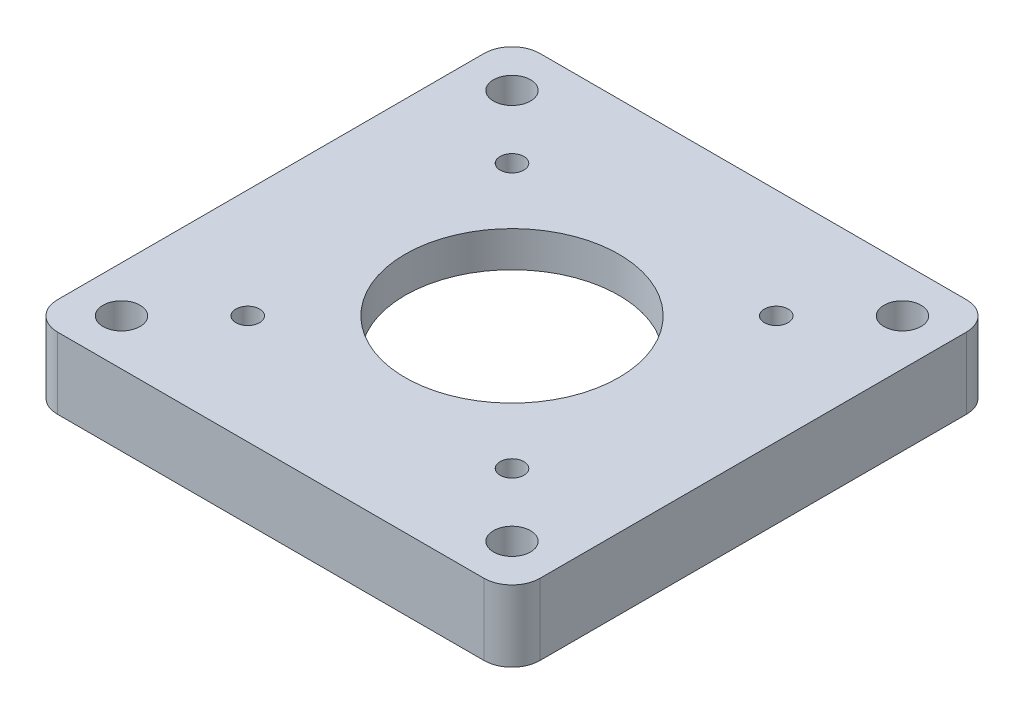
ISO-10303-21;
HEADER;
FILE_DESCRIPTION(('STEP AP214'),'2;1');
FILE_NAME('part.step','',(''),(''),'','','');
FILE_SCHEMA(('AUTOMOTIVE_DESIGN { 1 0 10303 214 1 1 1 1 }'));
ENDSEC;
DATA;
#1=APPLICATION_CONTEXT('core data for automotive mechanical design processes');
#2=APPLICATION_PROTOCOL_DEFINITION('international standard','automotive_design',2000,#1);
#3=PRODUCT_CONTEXT('',#1,'mechanical');
#4=PRODUCT('Part','Part','',(#3));
#5=PRODUCT_RELATED_PRODUCT_CATEGORY('part','',(#4));
#6=PRODUCT_DEFINITION_FORMATION('','',#4);
#7=PRODUCT_DEFINITION_CONTEXT('part definition',#1,'design');
#8=PRODUCT_DEFINITION('design','',#6,#7);
#9=PRODUCT_DEFINITION_SHAPE('','',#8);
#10=(LENGTH_UNIT() NAMED_UNIT(*) SI_UNIT(.MILLI.,.METRE.));
#11=(NAMED_UNIT(*) PLANE_ANGLE_UNIT() SI_UNIT($,.RADIAN.));
#12=(NAMED_UNIT(*) SI_UNIT($,.STERADIAN.) SOLID_ANGLE_UNIT());
#13=UNCERTAINTY_MEASURE_WITH_UNIT(LENGTH_MEASURE(1.E-05),#10,'distance_accuracy_value','');
#14=(GEOMETRIC_REPRESENTATION_CONTEXT(3) GLOBAL_UNCERTAINTY_ASSIGNED_CONTEXT((#13)) GLOBAL_UNIT_ASSIGNED_CONTEXT((#10,
#11,#12)) REPRESENTATION_CONTEXT('',''));
#15=CARTESIAN_POINT('',(0.,0.,0.));
#16=DIRECTION('',(0.,0.,1.));
#17=DIRECTION('',(1.,0.,0.));
#18=AXIS2_PLACEMENT_3D('',#15,#16,#17);
#19=CARTESIAN_POINT('',(0.,0.,0.));
#20=DIRECTION('',(0.,1.,0.));
#21=DIRECTION('',(1.,0.,0.));
#22=AXIS2_PLACEMENT_3D('',#19,#20,#21);
#23=PLANE('',#22);
#24=CARTESIAN_POINT('',(0.,0.,0.));
#25=DIRECTION('',(0.,-1.,0.));
#26=DIRECTION('',(1.,0.,0.));
#27=AXIS2_PLACEMENT_3D('',#24,#25,#26);
#28=CIRCLE('',#27,19.05);
#29=CARTESIAN_POINT('',(-19.05,0.,0.));
#30=VERTEX_POINT('',#29);
#31=EDGE_CURVE('E11',#30,#30,#28,.T.);
#32=ORIENTED_EDGE('',*,*,#31,.F.);
#33=EDGE_LOOP('',(#32));
#34=FACE_BOUND('',#33,.T.);
#35=CARTESIAN_POINT('',(-23.55,0.,23.55));
#36=DIRECTION('',(0.,1.,0.));
#37=DIRECTION('',(0.,0.,-1.));
#38=AXIS2_PLACEMENT_3D('',#35,#36,#37);
#39=CIRCLE('',#38,2.117);
#40=CARTESIAN_POINT('',(-23.55,0.,25.667));
#41=VERTEX_POINT('',#40);
#42=EDGE_CURVE('E290',#41,#41,#39,.T.);
#43=ORIENTED_EDGE('',*,*,#42,.T.);
#44=EDGE_LOOP('',(#43));
#45=FACE_BOUND('',#44,.T.);
#46=CARTESIAN_POINT('',(23.55,0.,-23.55));
#47=DIRECTION('',(0.,1.,0.));
#48=DIRECTION('',(0.,0.,-1.));
#49=AXIS2_PLACEMENT_3D('',#46,#47,#48);
#50=CIRCLE('',#49,2.117);
#51=CARTESIAN_POINT('',(23.55,0.,-21.433));
#52=VERTEX_POINT('',#51);
#53=EDGE_CURVE('E445',#52,#52,#50,.T.);
#54=ORIENTED_EDGE('',*,*,#53,.T.);
#55=EDGE_LOOP('',(#54));
#56=FACE_BOUND('',#55,.T.);
#57=CARTESIAN_POINT('',(23.55,0.,23.55));
#58=DIRECTION('',(0.,1.,0.));
#59=DIRECTION('',(0.,0.,-1.));
#60=AXIS2_PLACEMENT_3D('',#57,#58,#59);
#61=CIRCLE('',#60,2.117);
#62=CARTESIAN_POINT('',(23.55,0.,25.667));
#63=VERTEX_POINT('',#62);
#64=EDGE_CURVE('E318',#63,#63,#61,.T.);
#65=ORIENTED_EDGE('',*,*,#64,.T.);
#66=EDGE_LOOP('',(#65));
#67=FACE_BOUND('',#66,.T.);
#68=CARTESIAN_POINT('',(-23.55,0.,-23.55));
#69=DIRECTION('',(0.,1.,0.));
#70=DIRECTION('',(0.,0.,-1.));
#71=AXIS2_PLACEMENT_3D('',#68,#69,#70);
#72=CIRCLE('',#71,2.117);
#73=CARTESIAN_POINT('',(-23.55,0.,-21.433));
#74=VERTEX_POINT('',#73);
#75=EDGE_CURVE('E426',#74,#74,#72,.T.);
#76=ORIENTED_EDGE('',*,*,#75,.T.);
#77=EDGE_LOOP('',(#76));
#78=FACE_BOUND('',#77,.T.);
#79=CARTESIAN_POINT('',(0.,0.,0.));
#80=DIRECTION('',(0.,-1.,0.));
#81=DIRECTION('',(1.,0.,0.));
#82=AXIS2_PLACEMENT_3D('',#79,#80,#81);
#83=CIRCLE('',#82,36.5);
#84=CARTESIAN_POINT('',(-20.3216669399022,0.,-30.3196281768706));
#85=VERTEX_POINT('',#84);
#86=CARTESIAN_POINT('',(20.3216669399023,0.,-30.3196281768706));
#87=VERTEX_POINT('',#86);
#88=EDGE_CURVE('E407',#85,#87,#83,.T.);
#89=ORIENTED_EDGE('',*,*,#88,.T.);
#90=CARTESIAN_POINT('',(23.55,0.,-23.55));
#91=DIRECTION('',(0.,-1.,0.));
#92=DIRECTION('',(1.,0.,0.));
#93=AXIS2_PLACEMENT_3D('',#90,#91,#92);
#94=CIRCLE('',#93,7.5);
#95=CARTESIAN_POINT('',(30.3196281768706,0.,-20.3216669399023));
#96=VERTEX_POINT('',#95);
#97=EDGE_CURVE('E389',#87,#96,#94,.T.);
#98=ORIENTED_EDGE('',*,*,#97,.T.);
#99=CARTESIAN_POINT('',(0.,0.,0.));
#100=DIRECTION('',(0.,-1.,0.));
#101=DIRECTION('',(1.,0.,0.));
#102=AXIS2_PLACEMENT_3D('',#99,#100,#101);
#103=CIRCLE('',#102,36.5);
#104=CARTESIAN_POINT('',(30.3196281768706,0.,20.3216669399023));
#105=VERTEX_POINT('',#104);
#106=EDGE_CURVE('E397',#96,#105,#103,.T.);
#107=ORIENTED_EDGE('',*,*,#106,.T.);
#108=CARTESIAN_POINT('',(23.55,0.,23.55));
#109=DIRECTION('',(0.,-1.,0.));
#110=DIRECTION('',(1.,0.,0.));
#111=AXIS2_PLACEMENT_3D('',#108,#109,#110);
#112=CIRCLE('',#111,7.5);
#113=CARTESIAN_POINT('',(20.3216669399023,0.,30.3196281768706));
#114=VERTEX_POINT('',#113);
#115=EDGE_CURVE('E357',#105,#114,#112,.T.);
#116=ORIENTED_EDGE('',*,*,#115,.T.);
#117=CARTESIAN_POINT('',(0.,0.,0.));
#118=DIRECTION('',(0.,-1.,0.));
#119=DIRECTION('',(1.,0.,0.));
#120=AXIS2_PLACEMENT_3D('',#117,#118,#119);
#121=CIRCLE('',#120,36.5);
#122=CARTESIAN_POINT('',(-20.3216669399023,0.,30.3196281768706));
#123=VERTEX_POINT('',#122);
#124=EDGE_CURVE('E401',#114,#123,#121,.T.);
#125=ORIENTED_EDGE('',*,*,#124,.T.);
#126=CARTESIAN_POINT('',(-23.55,0.,23.55));
#127=DIRECTION('',(0.,-1.,0.));
#128=DIRECTION('',(1.,0.,0.));
#129=AXIS2_PLACEMENT_3D('',#126,#127,#128);
#130=CIRCLE('',#129,7.5);
#131=CARTESIAN_POINT('',(-30.3196281768706,0.,20.3216669399023));
#132=VERTEX_POINT('',#131);
#133=EDGE_CURVE('E373',#123,#132,#130,.T.);
#134=ORIENTED_EDGE('',*,*,#133,.T.);
#135=CARTESIAN_POINT('',(0.,0.,0.));
#136=DIRECTION('',(0.,-1.,0.));
#137=DIRECTION('',(1.,0.,0.));
#138=AXIS2_PLACEMENT_3D('',#135,#136,#137);
#139=CIRCLE('',#138,36.5);
#140=CARTESIAN_POINT('',(-30.3196281768706,0.,-20.3216669399023));
#141=VERTEX_POINT('',#140);
#142=EDGE_CURVE('E404',#132,#141,#139,.T.);
#143=ORIENTED_EDGE('',*,*,#142,.T.);
#144=CARTESIAN_POINT('',(-23.55,0.,-23.55));
#145=DIRECTION('',(0.,-1.,0.));
#146=DIRECTION('',(1.,0.,0.));
#147=AXIS2_PLACEMENT_3D('',#144,#145,#146);
#148=CIRCLE('',#147,7.5);
#149=EDGE_CURVE('E246',#141,#85,#148,.T.);
#150=ORIENTED_EDGE('',*,*,#149,.T.);
#151=EDGE_LOOP('',(#89,#98,#107,#116,#125,#134,#143,#150));
#152=FACE_BOUND('',#151,.T.);
#153=ADVANCED_FACE('F17',(#34,#45,#56,#67,#78,#152),#23,.F.);
#154=CARTESIAN_POINT('',(0.,6.35,0.));
#155=DIRECTION('',(0.,1.,0.));
#156=DIRECTION('',(1.,0.,0.));
#157=AXIS2_PLACEMENT_3D('',#154,#155,#156);
#158=PLANE('',#157);
#159=CARTESIAN_POINT('',(0.,6.35,0.));
#160=DIRECTION('',(0.,-1.,0.));
#161=DIRECTION('',(1.,0.,0.));
#162=AXIS2_PLACEMENT_3D('',#159,#160,#161);
#163=CIRCLE('',#162,19.05);
#164=CARTESIAN_POINT('',(-19.05,6.35,0.));
#165=VERTEX_POINT('',#164);
#166=EDGE_CURVE('E460',#165,#165,#163,.T.);
#167=ORIENTED_EDGE('',*,*,#166,.T.);
#168=EDGE_LOOP('',(#167));
#169=FACE_BOUND('',#168,.T.);
#170=CARTESIAN_POINT('',(-23.55,6.35,23.55));
#171=DIRECTION('',(0.,-1.,0.));
#172=DIRECTION('',(0.,0.,-1.));
#173=AXIS2_PLACEMENT_3D('',#170,#171,#172);
#174=CIRCLE('',#173,2.117);
#175=CARTESIAN_POINT('',(-23.55,6.35,25.667));
#176=VERTEX_POINT('',#175);
#177=EDGE_CURVE('E452',#176,#176,#174,.T.);
#178=ORIENTED_EDGE('',*,*,#177,.T.);
#179=EDGE_LOOP('',(#178));
#180=FACE_BOUND('',#179,.T.);
#181=CARTESIAN_POINT('',(23.55,6.35,-23.55));
#182=DIRECTION('',(0.,-1.,0.));
#183=DIRECTION('',(0.,0.,-1.));
#184=AXIS2_PLACEMENT_3D('',#181,#182,#183);
#185=CIRCLE('',#184,2.117);
#186=CARTESIAN_POINT('',(23.55,6.35,-21.433));
#187=VERTEX_POINT('',#186);
#188=EDGE_CURVE('E90',#187,#187,#185,.T.);
#189=ORIENTED_EDGE('',*,*,#188,.T.);
#190=EDGE_LOOP('',(#189));
#191=FACE_BOUND('',#190,.T.);
#192=CARTESIAN_POINT('',(23.55,6.35,23.55));
#193=DIRECTION('',(0.,-1.,0.));
#194=DIRECTION('',(0.,0.,-1.));
#195=AXIS2_PLACEMENT_3D('',#192,#193,#194);
#196=CIRCLE('',#195,2.117);
#197=CARTESIAN_POINT('',(23.55,6.35,25.667));
#198=VERTEX_POINT('',#197);
#199=EDGE_CURVE('E320',#198,#198,#196,.T.);
#200=ORIENTED_EDGE('',*,*,#199,.T.);
#201=EDGE_LOOP('',(#200));
#202=FACE_BOUND('',#201,.T.);
#203=CARTESIAN_POINT('',(-23.55,6.35,-23.55));
#204=DIRECTION('',(0.,-1.,0.));
#205=DIRECTION('',(0.,0.,-1.));
#206=AXIS2_PLACEMENT_3D('',#203,#204,#205);
#207=CIRCLE('',#206,2.117);
#208=CARTESIAN_POINT('',(-23.55,6.35,-21.433));
#209=VERTEX_POINT('',#208);
#210=EDGE_CURVE('E432',#209,#209,#207,.T.);
#211=ORIENTED_EDGE('',*,*,#210,.T.);
#212=EDGE_LOOP('',(#211));
#213=FACE_BOUND('',#212,.T.);
#214=CARTESIAN_POINT('',(34.8,6.35,-34.8));
#215=DIRECTION('',(0.,-1.,0.));
#216=DIRECTION('',(1.,0.,0.));
#217=AXIS2_PLACEMENT_3D('',#214,#215,#216);
#218=CIRCLE('',#217,3.3);
#219=CARTESIAN_POINT('',(31.5,6.35,-34.8));
#220=VERTEX_POINT('',#219);
#221=EDGE_CURVE('E421',#220,#220,#218,.T.);
#222=ORIENTED_EDGE('',*,*,#221,.T.);
#223=EDGE_LOOP('',(#222));
#224=FACE_BOUND('',#223,.T.);
#225=CARTESIAN_POINT('',(-34.8,6.35,34.8));
#226=DIRECTION('',(0.,-1.,0.));
#227=DIRECTION('',(1.,0.,0.));
#228=AXIS2_PLACEMENT_3D('',#225,#226,#227);
#229=CIRCLE('',#228,3.3);
#230=CARTESIAN_POINT('',(-38.1,6.35,34.8));
#231=VERTEX_POINT('',#230);
#232=EDGE_CURVE('E364',#231,#231,#229,.T.);
#233=ORIENTED_EDGE('',*,*,#232,.T.);
#234=EDGE_LOOP('',(#233));
#235=FACE_BOUND('',#234,.T.);
#236=CARTESIAN_POINT('',(34.8,6.35,34.8));
#237=DIRECTION('',(0.,-1.,0.));
#238=DIRECTION('',(1.,0.,0.));
#239=AXIS2_PLACEMENT_3D('',#236,#237,#238);
#240=CIRCLE('',#239,3.3);
#241=CARTESIAN_POINT('',(31.5,6.35,34.8));
#242=VERTEX_POINT('',#241);
#243=EDGE_CURVE('E378',#242,#242,#240,.T.);
#244=ORIENTED_EDGE('',*,*,#243,.T.);
#245=EDGE_LOOP('',(#244));
#246=FACE_BOUND('',#245,.T.);
#247=CARTESIAN_POINT('',(-34.8,6.35,-34.8));
#248=DIRECTION('',(0.,-1.,0.));
#249=DIRECTION('',(1.,0.,0.));
#250=AXIS2_PLACEMENT_3D('',#247,#248,#249);
#251=CIRCLE('',#250,3.3);
#252=CARTESIAN_POINT('',(-38.1,6.35,-34.8));
#253=VERTEX_POINT('',#252);
#254=EDGE_CURVE('E368',#253,#253,#251,.T.);
#255=ORIENTED_EDGE('',*,*,#254,.T.);
#256=EDGE_LOOP('',(#255));
#257=FACE_BOUND('',#256,.T.);
#258=CARTESIAN_POINT('',(-38.,6.35,38.));
#259=DIRECTION('',(0.,-1.,0.));
#260=DIRECTION('',(-0.707106781186548,0.,0.707106781186548));
#261=AXIS2_PLACEMENT_3D('',#258,#259,#260);
#262=CIRCLE('',#261,5.);
#263=CARTESIAN_POINT('',(-38.,6.35,43.));
#264=VERTEX_POINT('',#263);
#265=CARTESIAN_POINT('',(-43.,6.35,38.));
#266=VERTEX_POINT('',#265);
#267=EDGE_CURVE('E474',#264,#266,#262,.T.);
#268=ORIENTED_EDGE('',*,*,#267,.F.);
#269=DIRECTION('',(1.,0.,0.));
#270=VECTOR('',#269,1.);
#271=CARTESIAN_POINT('',(-43.,6.35,43.));
#272=LINE('',#271,#270);
#273=CARTESIAN_POINT('',(38.,6.35,43.));
#274=VERTEX_POINT('',#273);
#275=EDGE_CURVE('E491',#264,#274,#272,.T.);
#276=ORIENTED_EDGE('',*,*,#275,.T.);
#277=CARTESIAN_POINT('',(38.,6.35,38.));
#278=DIRECTION('',(0.,-1.,0.));
#279=DIRECTION('',(0.707106781186548,0.,0.707106781186548));
#280=AXIS2_PLACEMENT_3D('',#277,#278,#279);
#281=CIRCLE('',#280,5.);
#282=CARTESIAN_POINT('',(43.,6.35,38.));
#283=VERTEX_POINT('',#282);
#284=EDGE_CURVE('E323',#283,#274,#281,.T.);
#285=ORIENTED_EDGE('',*,*,#284,.F.);
#286=DIRECTION('',(0.,0.,-1.));
#287=VECTOR('',#286,1.);
#288=CARTESIAN_POINT('',(43.,6.35,43.));
#289=LINE('',#288,#287);
#290=CARTESIAN_POINT('',(43.,6.35,-38.));
#291=VERTEX_POINT('',#290);
#292=EDGE_CURVE('E328',#283,#291,#289,.T.);
#293=ORIENTED_EDGE('',*,*,#292,.T.);
#294=CARTESIAN_POINT('',(38.,6.35,-38.));
#295=DIRECTION('',(0.,-1.,0.));
#296=DIRECTION('',(0.707106781186548,0.,-0.707106781186548));
#297=AXIS2_PLACEMENT_3D('',#294,#295,#296);
#298=CIRCLE('',#297,5.);
#299=CARTESIAN_POINT('',(38.,6.35,-43.));
#300=VERTEX_POINT('',#299);
#301=EDGE_CURVE('E329',#300,#291,#298,.T.);
#302=ORIENTED_EDGE('',*,*,#301,.F.);
#303=DIRECTION('',(-1.,0.,0.));
#304=VECTOR('',#303,1.);
#305=CARTESIAN_POINT('',(43.,6.35,-43.));
#306=LINE('',#305,#304);
#307=CARTESIAN_POINT('',(-38.,6.35,-43.));
#308=VERTEX_POINT('',#307);
#309=EDGE_CURVE('E340',#300,#308,#306,.T.);
#310=ORIENTED_EDGE('',*,*,#309,.T.);
#311=CARTESIAN_POINT('',(-38.,6.35,-38.));
#312=DIRECTION('',(0.,-1.,0.));
#313=DIRECTION('',(-0.707106781186548,0.,-0.707106781186548));
#314=AXIS2_PLACEMENT_3D('',#311,#312,#313);
#315=CIRCLE('',#314,5.);
#316=CARTESIAN_POINT('',(-43.,6.35,-38.));
#317=VERTEX_POINT('',#316);
#318=EDGE_CURVE('E342',#317,#308,#315,.T.);
#319=ORIENTED_EDGE('',*,*,#318,.F.);
#320=DIRECTION('',(0.,0.,1.));
#321=VECTOR('',#320,1.);
#322=CARTESIAN_POINT('',(-43.,6.35,-43.));
#323=LINE('',#322,#321);
#324=EDGE_CURVE('E351',#317,#266,#323,.T.);
#325=ORIENTED_EDGE('',*,*,#324,.T.);
#326=EDGE_LOOP('',(#268,#276,#285,#293,#302,#310,#319,#325));
#327=FACE_BOUND('',#326,.T.);
#328=ADVANCED_FACE('F560',(#169,#180,#191,#202,#213,#224,#235,#246,#257,#327),#158,.T.);
#329=CARTESIAN_POINT('',(0.,0.,0.));
#330=DIRECTION('',(0.,1.,0.));
#331=DIRECTION('',(1.,0.,0.));
#332=AXIS2_PLACEMENT_3D('',#329,#330,#331);
#333=CYLINDRICAL_SURFACE('',#332,19.05);
#334=ORIENTED_EDGE('',*,*,#166,.F.);
#335=DIRECTION('',(0.,-1.,0.));
#336=VECTOR('',#335,1.);
#337=CARTESIAN_POINT('',(-19.05,0.,0.));
#338=LINE('',#337,#336);
#339=EDGE_CURVE('E27',#165,#30,#338,.T.);
#340=ORIENTED_EDGE('',*,*,#339,.T.);
#341=ORIENTED_EDGE('',*,*,#31,.T.);
#342=ORIENTED_EDGE('',*,*,#339,.F.);
#343=EDGE_LOOP('',(#334,#340,#341,#342));
#344=FACE_BOUND('',#343,.T.);
#345=ADVANCED_FACE('F565',(#344),#333,.F.);
#346=CARTESIAN_POINT('',(-23.55,3.4925,23.55));
#347=DIRECTION('',(0.,1.,0.));
#348=DIRECTION('',(0.,0.,-1.));
#349=AXIS2_PLACEMENT_3D('',#346,#347,#348);
#350=CYLINDRICAL_SURFACE('',#349,2.117);
#351=ORIENTED_EDGE('',*,*,#42,.F.);
#352=DIRECTION('',(0.,1.,0.));
#353=VECTOR('',#352,1.);
#354=CARTESIAN_POINT('',(-23.55,3.4925,25.667));
#355=LINE('',#354,#353);
#356=EDGE_CURVE('E450',#41,#176,#355,.T.);
#357=ORIENTED_EDGE('',*,*,#356,.T.);
#358=ORIENTED_EDGE('',*,*,#177,.F.);
#359=ORIENTED_EDGE('',*,*,#356,.F.);
#360=EDGE_LOOP('',(#351,#357,#358,#359));
#361=FACE_BOUND('',#360,.T.);
#362=ADVANCED_FACE('F567',(#361),#350,.F.);
#363=CARTESIAN_POINT('',(23.55,3.4925,-23.55));
#364=DIRECTION('',(0.,1.,0.));
#365=DIRECTION('',(0.,0.,-1.));
#366=AXIS2_PLACEMENT_3D('',#363,#364,#365);
#367=CYLINDRICAL_SURFACE('',#366,2.117);
#368=ORIENTED_EDGE('',*,*,#53,.F.);
#369=DIRECTION('',(0.,1.,0.));
#370=VECTOR('',#369,1.);
#371=CARTESIAN_POINT('',(23.55,3.4925,-21.433));
#372=LINE('',#371,#370);
#373=EDGE_CURVE('E82',#52,#187,#372,.T.);
#374=ORIENTED_EDGE('',*,*,#373,.T.);
#375=ORIENTED_EDGE('',*,*,#188,.F.);
#376=ORIENTED_EDGE('',*,*,#373,.F.);
#377=EDGE_LOOP('',(#368,#374,#375,#376));
#378=FACE_BOUND('',#377,.T.);
#379=ADVANCED_FACE('F577',(#378),#367,.F.);
#380=CARTESIAN_POINT('',(23.55,3.4925,23.55));
#381=DIRECTION('',(0.,1.,0.));
#382=DIRECTION('',(0.,0.,-1.));
#383=AXIS2_PLACEMENT_3D('',#380,#381,#382);
#384=CYLINDRICAL_SURFACE('',#383,2.117);
#385=ORIENTED_EDGE('',*,*,#64,.F.);
#386=DIRECTION('',(0.,1.,0.));
#387=VECTOR('',#386,1.);
#388=CARTESIAN_POINT('',(23.55,3.4925,25.667));
#389=LINE('',#388,#387);
#390=EDGE_CURVE('E311',#63,#198,#389,.T.);
#391=ORIENTED_EDGE('',*,*,#390,.T.);
#392=ORIENTED_EDGE('',*,*,#199,.F.);
#393=ORIENTED_EDGE('',*,*,#390,.F.);
#394=EDGE_LOOP('',(#385,#391,#392,#393));
#395=FACE_BOUND('',#394,.T.);
#396=ADVANCED_FACE('F578',(#395),#384,.F.);
#397=CARTESIAN_POINT('',(-23.55,3.4925,-23.55));
#398=DIRECTION('',(0.,1.,0.));
#399=DIRECTION('',(0.,0.,-1.));
#400=AXIS2_PLACEMENT_3D('',#397,#398,#399);
#401=CYLINDRICAL_SURFACE('',#400,2.117);
#402=ORIENTED_EDGE('',*,*,#75,.F.);
#403=DIRECTION('',(0.,1.,0.));
#404=VECTOR('',#403,1.);
#405=CARTESIAN_POINT('',(-23.55,3.4925,-21.433));
#406=LINE('',#405,#404);
#407=EDGE_CURVE('E429',#74,#209,#406,.T.);
#408=ORIENTED_EDGE('',*,*,#407,.T.);
#409=ORIENTED_EDGE('',*,*,#210,.F.);
#410=ORIENTED_EDGE('',*,*,#407,.F.);
#411=EDGE_LOOP('',(#402,#408,#409,#410));
#412=FACE_BOUND('',#411,.T.);
#413=ADVANCED_FACE('F581',(#412),#401,.F.);
#414=CARTESIAN_POINT('',(34.8,0.,-34.8));
#415=DIRECTION('',(0.,-1.,0.));
#416=DIRECTION('',(1.,0.,0.));
#417=AXIS2_PLACEMENT_3D('',#414,#415,#416);
#418=CYLINDRICAL_SURFACE('',#417,3.3);
#419=CARTESIAN_POINT('',(34.8,-6.35,-34.8));
#420=DIRECTION('',(0.,1.,0.));
#421=DIRECTION('',(1.,0.,0.));
#422=AXIS2_PLACEMENT_3D('',#419,#420,#421);
#423=CIRCLE('',#422,3.3);
#424=CARTESIAN_POINT('',(31.5,-6.35,-34.8));
#425=VERTEX_POINT('',#424);
#426=EDGE_CURVE('E283',#425,#425,#423,.T.);
#427=ORIENTED_EDGE('',*,*,#426,.F.);
#428=DIRECTION('',(0.,1.,0.));
#429=VECTOR('',#428,1.);
#430=CARTESIAN_POINT('',(31.5,0.,-34.8));
#431=LINE('',#430,#429);
#432=EDGE_CURVE('E420',#425,#220,#431,.T.);
#433=ORIENTED_EDGE('',*,*,#432,.T.);
#434=ORIENTED_EDGE('',*,*,#221,.F.);
#435=ORIENTED_EDGE('',*,*,#432,.F.);
#436=EDGE_LOOP('',(#427,#433,#434,#435));
#437=FACE_BOUND('',#436,.T.);
#438=ADVANCED_FACE('F590',(#437),#418,.F.);
#439=CARTESIAN_POINT('',(34.8,0.,34.8));
#440=DIRECTION('',(0.,-1.,0.));
#441=DIRECTION('',(1.,0.,0.));
#442=AXIS2_PLACEMENT_3D('',#439,#440,#441);
#443=CYLINDRICAL_SURFACE('',#442,3.3);
#444=CARTESIAN_POINT('',(34.8,-6.35,34.8));
#445=DIRECTION('',(0.,1.,0.));
#446=DIRECTION('',(1.,0.,0.));
#447=AXIS2_PLACEMENT_3D('',#444,#445,#446);
#448=CIRCLE('',#447,3.3);
#449=CARTESIAN_POINT('',(31.5,-6.35,34.8));
#450=VERTEX_POINT('',#449);
#451=EDGE_CURVE('E310',#450,#450,#448,.T.);
#452=ORIENTED_EDGE('',*,*,#451,.F.);
#453=DIRECTION('',(0.,1.,0.));
#454=VECTOR('',#453,1.);
#455=CARTESIAN_POINT('',(31.5,0.,34.8));
#456=LINE('',#455,#454);
#457=EDGE_CURVE('E372',#450,#242,#456,.T.);
#458=ORIENTED_EDGE('',*,*,#457,.T.);
#459=ORIENTED_EDGE('',*,*,#243,.F.);
#460=ORIENTED_EDGE('',*,*,#457,.F.);
#461=EDGE_LOOP('',(#452,#458,#459,#460));
#462=FACE_BOUND('',#461,.T.);
#463=ADVANCED_FACE('F591',(#462),#443,.F.);
#464=CARTESIAN_POINT('',(-34.8,0.,34.8));
#465=DIRECTION('',(0.,-1.,0.));
#466=DIRECTION('',(1.,0.,0.));
#467=AXIS2_PLACEMENT_3D('',#464,#465,#466);
#468=CYLINDRICAL_SURFACE('',#467,3.3);
#469=CARTESIAN_POINT('',(-34.8,-6.35,34.8));
#470=DIRECTION('',(0.,1.,0.));
#471=DIRECTION('',(1.,0.,0.));
#472=AXIS2_PLACEMENT_3D('',#469,#470,#471);
#473=CIRCLE('',#472,3.3);
#474=CARTESIAN_POINT('',(-38.1,-6.35,34.8));
#475=VERTEX_POINT('',#474);
#476=EDGE_CURVE('E303',#475,#475,#473,.T.);
#477=ORIENTED_EDGE('',*,*,#476,.F.);
#478=DIRECTION('',(0.,1.,0.));
#479=VECTOR('',#478,1.);
#480=CARTESIAN_POINT('',(-38.1,0.,34.8));
#481=LINE('',#480,#479);
#482=EDGE_CURVE('E363',#475,#231,#481,.T.);
#483=ORIENTED_EDGE('',*,*,#482,.T.);
#484=ORIENTED_EDGE('',*,*,#232,.F.);
#485=ORIENTED_EDGE('',*,*,#482,.F.);
#486=EDGE_LOOP('',(#477,#483,#484,#485));
#487=FACE_BOUND('',#486,.T.);
#488=ADVANCED_FACE('F594',(#487),#468,.F.);
#489=CARTESIAN_POINT('',(-34.8,0.,-34.8));
#490=DIRECTION('',(0.,-1.,0.));
#491=DIRECTION('',(1.,0.,0.));
#492=AXIS2_PLACEMENT_3D('',#489,#490,#491);
#493=CYLINDRICAL_SURFACE('',#492,3.3);
#494=CARTESIAN_POINT('',(-34.8,-6.35,-34.8));
#495=DIRECTION('',(0.,1.,0.));
#496=DIRECTION('',(1.,0.,0.));
#497=AXIS2_PLACEMENT_3D('',#494,#495,#496);
#498=CIRCLE('',#497,3.3);
#499=CARTESIAN_POINT('',(-38.1,-6.35,-34.8));
#500=VERTEX_POINT('',#499);
#501=EDGE_CURVE('E302',#500,#500,#498,.T.);
#502=ORIENTED_EDGE('',*,*,#501,.F.);
#503=DIRECTION('',(0.,1.,0.));
#504=VECTOR('',#503,1.);
#505=CARTESIAN_POINT('',(-38.1,0.,-34.8));
#506=LINE('',#505,#504);
#507=EDGE_CURVE('E412',#500,#253,#506,.T.);
#508=ORIENTED_EDGE('',*,*,#507,.T.);
#509=ORIENTED_EDGE('',*,*,#254,.F.);
#510=ORIENTED_EDGE('',*,*,#507,.F.);
#511=EDGE_LOOP('',(#502,#508,#509,#510));
#512=FACE_BOUND('',#511,.T.);
#513=ADVANCED_FACE('F597',(#512),#493,.F.);
#514=CARTESIAN_POINT('',(0.,0.,0.));
#515=DIRECTION('',(0.,-1.,0.));
#516=DIRECTION('',(1.,0.,0.));
#517=AXIS2_PLACEMENT_3D('',#514,#515,#516);
#518=CYLINDRICAL_SURFACE('',#517,36.5);
#519=DIRECTION('',(0.,-1.,0.));
#520=VECTOR('',#519,1.);
#521=CARTESIAN_POINT('',(-20.3216669399023,0.,-30.3196281768706));
#522=LINE('',#521,#520);
#523=CARTESIAN_POINT('',(-20.3216669399022,-6.35,-30.3196281768706));
#524=VERTEX_POINT('',#523);
#525=EDGE_CURVE('E251',#85,#524,#522,.T.);
#526=ORIENTED_EDGE('',*,*,#525,.T.);
#527=CARTESIAN_POINT('',(0.,-6.35,0.));
#528=DIRECTION('',(0.,1.,0.));
#529=DIRECTION('',(1.,0.,0.));
#530=AXIS2_PLACEMENT_3D('',#527,#528,#529);
#531=CIRCLE('',#530,36.5);
#532=CARTESIAN_POINT('',(20.3216669399023,-6.35,-30.3196281768706));
#533=VERTEX_POINT('',#532);
#534=EDGE_CURVE('E271',#533,#524,#531,.T.);
#535=ORIENTED_EDGE('',*,*,#534,.F.);
#536=DIRECTION('',(0.,1.,0.));
#537=VECTOR('',#536,1.);
#538=CARTESIAN_POINT('',(20.3216669399023,0.,-30.3196281768706));
#539=LINE('',#538,#537);
#540=EDGE_CURVE('E392',#533,#87,#539,.T.);
#541=ORIENTED_EDGE('',*,*,#540,.T.);
#542=ORIENTED_EDGE('',*,*,#88,.F.);
#543=EDGE_LOOP('',(#526,#535,#541,#542));
#544=FACE_BOUND('',#543,.T.);
#545=ADVANCED_FACE('F602',(#544),#518,.F.);
#546=CARTESIAN_POINT('',(0.,0.,0.));
#547=DIRECTION('',(0.,-1.,0.));
#548=DIRECTION('',(-1.,0.,0.));
#549=AXIS2_PLACEMENT_3D('',#546,#547,#548);
#550=CYLINDRICAL_SURFACE('',#549,36.5);
#551=DIRECTION('',(0.,1.,0.));
#552=VECTOR('',#551,1.);
#553=CARTESIAN_POINT('',(-30.3196281768706,0.,-20.3216669399023));
#554=LINE('',#553,#552);
#555=CARTESIAN_POINT('',(-30.3196281768706,-6.35,-20.3216669399023));
#556=VERTEX_POINT('',#555);
#557=EDGE_CURVE('E245',#556,#141,#554,.T.);
#558=ORIENTED_EDGE('',*,*,#557,.T.);
#559=ORIENTED_EDGE('',*,*,#142,.F.);
#560=DIRECTION('',(0.,-1.,0.));
#561=VECTOR('',#560,1.);
#562=CARTESIAN_POINT('',(-30.3196281768706,0.,20.3216669399023));
#563=LINE('',#562,#561);
#564=CARTESIAN_POINT('',(-30.3196281768706,-6.35,20.3216669399023));
#565=VERTEX_POINT('',#564);
#566=EDGE_CURVE('E259',#132,#565,#563,.T.);
#567=ORIENTED_EDGE('',*,*,#566,.T.);
#568=CARTESIAN_POINT('',(0.,-6.35,0.));
#569=DIRECTION('',(0.,1.,0.));
#570=DIRECTION('',(1.,0.,0.));
#571=AXIS2_PLACEMENT_3D('',#568,#569,#570);
#572=CIRCLE('',#571,36.5);
#573=EDGE_CURVE('E258',#556,#565,#572,.T.);
#574=ORIENTED_EDGE('',*,*,#573,.F.);
#575=EDGE_LOOP('',(#558,#559,#567,#574));
#576=FACE_BOUND('',#575,.T.);
#577=ADVANCED_FACE('F260',(#576),#550,.F.);
#578=CARTESIAN_POINT('',(0.,0.,0.));
#579=DIRECTION('',(0.,-1.,0.));
#580=DIRECTION('',(1.,0.,0.));
#581=AXIS2_PLACEMENT_3D('',#578,#579,#580);
#582=CYLINDRICAL_SURFACE('',#581,36.5);
#583=DIRECTION('',(0.,-1.,0.));
#584=VECTOR('',#583,1.);
#585=CARTESIAN_POINT('',(20.3216669399023,0.,30.3196281768706));
#586=LINE('',#585,#584);
#587=CARTESIAN_POINT('',(20.3216669399023,-6.35,30.3196281768706));
#588=VERTEX_POINT('',#587);
#589=EDGE_CURVE('E367',#114,#588,#586,.T.);
#590=ORIENTED_EDGE('',*,*,#589,.T.);
#591=CARTESIAN_POINT('',(0.,-6.35,0.));
#592=DIRECTION('',(0.,1.,0.));
#593=DIRECTION('',(1.,0.,0.));
#594=AXIS2_PLACEMENT_3D('',#591,#592,#593);
#595=CIRCLE('',#594,36.5);
#596=CARTESIAN_POINT('',(-20.3216669399023,-6.35,30.3196281768706));
#597=VERTEX_POINT('',#596);
#598=EDGE_CURVE('E292',#597,#588,#595,.T.);
#599=ORIENTED_EDGE('',*,*,#598,.F.);
#600=DIRECTION('',(0.,1.,0.));
#601=VECTOR('',#600,1.);
#602=CARTESIAN_POINT('',(-20.3216669399023,0.,30.3196281768706));
#603=LINE('',#602,#601);
#604=EDGE_CURVE('E385',#597,#123,#603,.T.);
#605=ORIENTED_EDGE('',*,*,#604,.T.);
#606=ORIENTED_EDGE('',*,*,#124,.F.);
#607=EDGE_LOOP('',(#590,#599,#605,#606));
#608=FACE_BOUND('',#607,.T.);
#609=ADVANCED_FACE('F608',(#608),#582,.F.);
#610=CARTESIAN_POINT('',(0.,0.,0.));
#611=DIRECTION('',(0.,-1.,0.));
#612=DIRECTION('',(1.,0.,0.));
#613=AXIS2_PLACEMENT_3D('',#610,#611,#612);
#614=CYLINDRICAL_SURFACE('',#613,36.5);
#615=DIRECTION('',(0.,1.,0.));
#616=VECTOR('',#615,1.);
#617=CARTESIAN_POINT('',(30.3196281768706,0.,20.3216669399023));
#618=LINE('',#617,#616);
#619=CARTESIAN_POINT('',(30.3196281768706,-6.35,20.3216669399023));
#620=VERTEX_POINT('',#619);
#621=EDGE_CURVE('E358',#620,#105,#618,.T.);
#622=ORIENTED_EDGE('',*,*,#621,.T.);
#623=ORIENTED_EDGE('',*,*,#106,.F.);
#624=DIRECTION('',(0.,-1.,0.));
#625=VECTOR('',#624,1.);
#626=CARTESIAN_POINT('',(30.3196281768706,0.,-20.3216669399023));
#627=LINE('',#626,#625);
#628=CARTESIAN_POINT('',(30.3196281768706,-6.35,-20.3216669399023));
#629=VERTEX_POINT('',#628);
#630=EDGE_CURVE('E396',#96,#629,#627,.T.);
#631=ORIENTED_EDGE('',*,*,#630,.T.);
#632=CARTESIAN_POINT('',(0.,-6.35,0.));
#633=DIRECTION('',(0.,1.,0.));
#634=DIRECTION('',(1.,0.,0.));
#635=AXIS2_PLACEMENT_3D('',#632,#633,#634);
#636=CIRCLE('',#635,36.5);
#637=EDGE_CURVE('E293',#620,#629,#636,.T.);
#638=ORIENTED_EDGE('',*,*,#637,.F.);
#639=EDGE_LOOP('',(#622,#623,#631,#638));
#640=FACE_BOUND('',#639,.T.);
#641=ADVANCED_FACE('F611',(#640),#614,.F.);
#642=CARTESIAN_POINT('',(23.55,0.,-23.55));
#643=DIRECTION('',(0.,-1.,0.));
#644=DIRECTION('',(1.,0.,0.));
#645=AXIS2_PLACEMENT_3D('',#642,#643,#644);
#646=CYLINDRICAL_SURFACE('',#645,7.5);
#647=ORIENTED_EDGE('',*,*,#97,.F.);
#648=ORIENTED_EDGE('',*,*,#540,.F.);
#649=CARTESIAN_POINT('',(23.55,-6.35,-23.55));
#650=DIRECTION('',(0.,1.,0.));
#651=DIRECTION('',(1.,0.,0.));
#652=AXIS2_PLACEMENT_3D('',#649,#650,#651);
#653=CIRCLE('',#652,7.5);
#654=EDGE_CURVE('E297',#629,#533,#653,.T.);
#655=ORIENTED_EDGE('',*,*,#654,.F.);
#656=ORIENTED_EDGE('',*,*,#630,.F.);
#657=EDGE_LOOP('',(#647,#648,#655,#656));
#658=FACE_BOUND('',#657,.T.);
#659=ADVANCED_FACE('F613',(#658),#646,.F.);
#660=CARTESIAN_POINT('',(-23.55,0.,23.55));
#661=DIRECTION('',(0.,-1.,0.));
#662=DIRECTION('',(-0.707106781186547,0.,0.707106781186548));
#663=AXIS2_PLACEMENT_3D('',#660,#661,#662);
#664=CYLINDRICAL_SURFACE('',#663,7.5);
#665=ORIENTED_EDGE('',*,*,#133,.F.);
#666=ORIENTED_EDGE('',*,*,#604,.F.);
#667=CARTESIAN_POINT('',(-23.55,-6.35,23.55));
#668=DIRECTION('',(0.,1.,0.));
#669=DIRECTION('',(1.,0.,0.));
#670=AXIS2_PLACEMENT_3D('',#667,#668,#669);
#671=CIRCLE('',#670,7.5);
#672=EDGE_CURVE('E262',#565,#597,#671,.T.);
#673=ORIENTED_EDGE('',*,*,#672,.F.);
#674=ORIENTED_EDGE('',*,*,#566,.F.);
#675=EDGE_LOOP('',(#665,#666,#673,#674));
#676=FACE_BOUND('',#675,.T.);
#677=ADVANCED_FACE('F618',(#676),#664,.F.);
#678=CARTESIAN_POINT('',(23.55,0.,23.55));
#679=DIRECTION('',(0.,-1.,0.));
#680=DIRECTION('',(1.,0.,0.));
#681=AXIS2_PLACEMENT_3D('',#678,#679,#680);
#682=CYLINDRICAL_SURFACE('',#681,7.5);
#683=ORIENTED_EDGE('',*,*,#115,.F.);
#684=ORIENTED_EDGE('',*,*,#621,.F.);
#685=CARTESIAN_POINT('',(23.55,-6.35,23.55));
#686=DIRECTION('',(0.,1.,0.));
#687=DIRECTION('',(1.,0.,0.));
#688=AXIS2_PLACEMENT_3D('',#685,#686,#687);
#689=CIRCLE('',#688,7.5);
#690=EDGE_CURVE('E287',#588,#620,#689,.T.);
#691=ORIENTED_EDGE('',*,*,#690,.F.);
#692=ORIENTED_EDGE('',*,*,#589,.F.);
#693=EDGE_LOOP('',(#683,#684,#691,#692));
#694=FACE_BOUND('',#693,.T.);
#695=ADVANCED_FACE('F621',(#694),#682,.F.);
#696=CARTESIAN_POINT('',(-23.55,0.,-23.55));
#697=DIRECTION('',(0.,-1.,0.));
#698=DIRECTION('',(-0.707106781186547,0.,-0.707106781186548));
#699=AXIS2_PLACEMENT_3D('',#696,#697,#698);
#700=CYLINDRICAL_SURFACE('',#699,7.5);
#701=ORIENTED_EDGE('',*,*,#149,.F.);
#702=ORIENTED_EDGE('',*,*,#557,.F.);
#703=CARTESIAN_POINT('',(-23.55,-6.35,-23.55));
#704=DIRECTION('',(0.,1.,0.));
#705=DIRECTION('',(1.,0.,0.));
#706=AXIS2_PLACEMENT_3D('',#703,#704,#705);
#707=CIRCLE('',#706,7.5);
#708=EDGE_CURVE('E250',#524,#556,#707,.T.);
#709=ORIENTED_EDGE('',*,*,#708,.F.);
#710=ORIENTED_EDGE('',*,*,#525,.F.);
#711=EDGE_LOOP('',(#701,#702,#709,#710));
#712=FACE_BOUND('',#711,.T.);
#713=ADVANCED_FACE('F243',(#712),#700,.F.);
#714=CARTESIAN_POINT('',(-43.,0.,43.));
#715=DIRECTION('',(-1.,0.,0.));
#716=DIRECTION('',(0.,0.,1.));
#717=AXIS2_PLACEMENT_3D('',#714,#715,#716);
#718=PLANE('',#717);
#719=DIRECTION('',(0.,-1.,0.));
#720=VECTOR('',#719,1.);
#721=CARTESIAN_POINT('',(-43.,0.,38.));
#722=LINE('',#721,#720);
#723=CARTESIAN_POINT('',(-43.,-6.35,38.));
#724=VERTEX_POINT('',#723);
#725=EDGE_CURVE('E479',#266,#724,#722,.T.);
#726=ORIENTED_EDGE('',*,*,#725,.F.);
#727=ORIENTED_EDGE('',*,*,#324,.F.);
#728=DIRECTION('',(0.,1.,0.));
#729=VECTOR('',#728,1.);
#730=CARTESIAN_POINT('',(-43.,0.,-38.));
#731=LINE('',#730,#729);
#732=CARTESIAN_POINT('',(-43.,-6.35,-38.));
#733=VERTEX_POINT('',#732);
#734=EDGE_CURVE('E346',#733,#317,#731,.T.);
#735=ORIENTED_EDGE('',*,*,#734,.F.);
#736=DIRECTION('',(0.,0.,-1.));
#737=VECTOR('',#736,1.);
#738=CARTESIAN_POINT('',(-43.,-6.35,-43.));
#739=LINE('',#738,#737);
#740=EDGE_CURVE('E486',#724,#733,#739,.T.);
#741=ORIENTED_EDGE('',*,*,#740,.F.);
#742=EDGE_LOOP('',(#726,#727,#735,#741));
#743=FACE_BOUND('',#742,.T.);
#744=ADVANCED_FACE('F547',(#743),#718,.T.);
#745=CARTESIAN_POINT('',(-38.,0.,-38.));
#746=DIRECTION('',(0.,1.,0.));
#747=DIRECTION('',(-0.707106781186548,0.,-0.707106781186548));
#748=AXIS2_PLACEMENT_3D('',#745,#746,#747);
#749=CYLINDRICAL_SURFACE('',#748,5.);
#750=ORIENTED_EDGE('',*,*,#318,.T.);
#751=DIRECTION('',(0.,-1.,0.));
#752=VECTOR('',#751,1.);
#753=CARTESIAN_POINT('',(-38.,0.,-43.));
#754=LINE('',#753,#752);
#755=CARTESIAN_POINT('',(-38.,-6.35,-43.));
#756=VERTEX_POINT('',#755);
#757=EDGE_CURVE('E337',#308,#756,#754,.T.);
#758=ORIENTED_EDGE('',*,*,#757,.T.);
#759=CARTESIAN_POINT('',(-38.,-6.35,-38.));
#760=DIRECTION('',(0.,1.,0.));
#761=DIRECTION('',(-0.707106781186548,0.,-0.707106781186548));
#762=AXIS2_PLACEMENT_3D('',#759,#760,#761);
#763=CIRCLE('',#762,5.);
#764=EDGE_CURVE('E489',#756,#733,#763,.T.);
#765=ORIENTED_EDGE('',*,*,#764,.T.);
#766=ORIENTED_EDGE('',*,*,#734,.T.);
#767=EDGE_LOOP('',(#750,#758,#765,#766));
#768=FACE_BOUND('',#767,.T.);
#769=ADVANCED_FACE('F552',(#768),#749,.T.);
#770=CARTESIAN_POINT('',(-43.,0.,-43.));
#771=DIRECTION('',(0.,0.,-1.));
#772=DIRECTION('',(0.,-1.,0.));
#773=AXIS2_PLACEMENT_3D('',#770,#771,#772);
#774=PLANE('',#773);
#775=DIRECTION('',(0.,1.,0.));
#776=VECTOR('',#775,1.);
#777=CARTESIAN_POINT('',(38.,0.,-43.));
#778=LINE('',#777,#776);
#779=CARTESIAN_POINT('',(38.,-6.35,-43.));
#780=VERTEX_POINT('',#779);
#781=EDGE_CURVE('E334',#780,#300,#778,.T.);
#782=ORIENTED_EDGE('',*,*,#781,.F.);
#783=DIRECTION('',(1.,0.,0.));
#784=VECTOR('',#783,1.);
#785=CARTESIAN_POINT('',(43.,-6.35,-43.));
#786=LINE('',#785,#784);
#787=EDGE_CURVE('E515',#756,#780,#786,.T.);
#788=ORIENTED_EDGE('',*,*,#787,.F.);
#789=ORIENTED_EDGE('',*,*,#757,.F.);
#790=ORIENTED_EDGE('',*,*,#309,.F.);
#791=EDGE_LOOP('',(#782,#788,#789,#790));
#792=FACE_BOUND('',#791,.T.);
#793=ADVANCED_FACE('F553',(#792),#774,.T.);
#794=CARTESIAN_POINT('',(38.,0.,-38.));
#795=DIRECTION('',(0.,1.,0.));
#796=DIRECTION('',(0.707106781186548,0.,-0.707106781186548));
#797=AXIS2_PLACEMENT_3D('',#794,#795,#796);
#798=CYLINDRICAL_SURFACE('',#797,5.);
#799=ORIENTED_EDGE('',*,*,#301,.T.);
#800=DIRECTION('',(0.,-1.,0.));
#801=VECTOR('',#800,1.);
#802=CARTESIAN_POINT('',(43.,0.,-38.));
#803=LINE('',#802,#801);
#804=CARTESIAN_POINT('',(43.,-6.35,-38.));
#805=VERTEX_POINT('',#804);
#806=EDGE_CURVE('E326',#291,#805,#803,.T.);
#807=ORIENTED_EDGE('',*,*,#806,.T.);
#808=CARTESIAN_POINT('',(38.,-6.35,-38.));
#809=DIRECTION('',(0.,1.,0.));
#810=DIRECTION('',(0.707106781186548,0.,-0.707106781186548));
#811=AXIS2_PLACEMENT_3D('',#808,#809,#810);
#812=CIRCLE('',#811,5.);
#813=EDGE_CURVE('E517',#805,#780,#812,.T.);
#814=ORIENTED_EDGE('',*,*,#813,.T.);
#815=ORIENTED_EDGE('',*,*,#781,.T.);
#816=EDGE_LOOP('',(#799,#807,#814,#815));
#817=FACE_BOUND('',#816,.T.);
#818=ADVANCED_FACE('F559',(#817),#798,.T.);
#819=CARTESIAN_POINT('',(43.,0.,-43.));
#820=DIRECTION('',(1.,0.,0.));
#821=DIRECTION('',(0.,1.,0.));
#822=AXIS2_PLACEMENT_3D('',#819,#820,#821);
#823=PLANE('',#822);
#824=DIRECTION('',(0.,1.,0.));
#825=VECTOR('',#824,1.);
#826=CARTESIAN_POINT('',(43.,0.,38.));
#827=LINE('',#826,#825);
#828=CARTESIAN_POINT('',(43.,-6.35,38.));
#829=VERTEX_POINT('',#828);
#830=EDGE_CURVE('E317',#829,#283,#827,.T.);
#831=ORIENTED_EDGE('',*,*,#830,.F.);
#832=DIRECTION('',(0.,0.,1.));
#833=VECTOR('',#832,1.);
#834=CARTESIAN_POINT('',(43.,-6.35,43.));
#835=LINE('',#834,#833);
#836=EDGE_CURVE('E278',#805,#829,#835,.T.);
#837=ORIENTED_EDGE('',*,*,#836,.F.);
#838=ORIENTED_EDGE('',*,*,#806,.F.);
#839=ORIENTED_EDGE('',*,*,#292,.F.);
#840=EDGE_LOOP('',(#831,#837,#838,#839));
#841=FACE_BOUND('',#840,.T.);
#842=ADVANCED_FACE('F531',(#841),#823,.T.);
#843=CARTESIAN_POINT('',(38.,0.,38.));
#844=DIRECTION('',(0.,-1.,0.));
#845=DIRECTION('',(0.707106781186548,0.,0.707106781186548));
#846=AXIS2_PLACEMENT_3D('',#843,#844,#845);
#847=CYLINDRICAL_SURFACE('',#846,5.);
#848=CARTESIAN_POINT('',(38.,-6.35,38.));
#849=DIRECTION('',(0.,1.,0.));
#850=DIRECTION('',(0.707106781186548,0.,0.707106781186548));
#851=AXIS2_PLACEMENT_3D('',#848,#849,#850);
#852=CIRCLE('',#851,5.);
#853=CARTESIAN_POINT('',(38.,-6.35,43.));
#854=VERTEX_POINT('',#853);
#855=EDGE_CURVE('E272',#854,#829,#852,.T.);
#856=ORIENTED_EDGE('',*,*,#855,.T.);
#857=ORIENTED_EDGE('',*,*,#830,.T.);
#858=ORIENTED_EDGE('',*,*,#284,.T.);
#859=DIRECTION('',(0.,-1.,0.));
#860=VECTOR('',#859,1.);
#861=CARTESIAN_POINT('',(38.,0.,43.));
#862=LINE('',#861,#860);
#863=EDGE_CURVE('E471',#274,#854,#862,.T.);
#864=ORIENTED_EDGE('',*,*,#863,.T.);
#865=EDGE_LOOP('',(#856,#857,#858,#864));
#866=FACE_BOUND('',#865,.T.);
#867=ADVANCED_FACE('F536',(#866),#847,.T.);
#868=CARTESIAN_POINT('',(0.,-6.35,0.));
#869=DIRECTION('',(0.,1.,0.));
#870=DIRECTION('',(1.,0.,0.));
#871=AXIS2_PLACEMENT_3D('',#868,#869,#870);
#872=PLANE('',#871);
#873=ORIENTED_EDGE('',*,*,#426,.T.);
#874=EDGE_LOOP('',(#873));
#875=FACE_BOUND('',#874,.T.);
#876=ORIENTED_EDGE('',*,*,#451,.T.);
#877=EDGE_LOOP('',(#876));
#878=FACE_BOUND('',#877,.T.);
#879=ORIENTED_EDGE('',*,*,#476,.T.);
#880=EDGE_LOOP('',(#879));
#881=FACE_BOUND('',#880,.T.);
#882=ORIENTED_EDGE('',*,*,#501,.T.);
#883=EDGE_LOOP('',(#882));
#884=FACE_BOUND('',#883,.T.);
#885=ORIENTED_EDGE('',*,*,#708,.T.);
#886=ORIENTED_EDGE('',*,*,#573,.T.);
#887=ORIENTED_EDGE('',*,*,#672,.T.);
#888=ORIENTED_EDGE('',*,*,#598,.T.);
#889=ORIENTED_EDGE('',*,*,#690,.T.);
#890=ORIENTED_EDGE('',*,*,#637,.T.);
#891=ORIENTED_EDGE('',*,*,#654,.T.);
#892=ORIENTED_EDGE('',*,*,#534,.T.);
#893=EDGE_LOOP('',(#885,#886,#887,#888,#889,#890,#891,#892));
#894=FACE_BOUND('',#893,.T.);
#895=CARTESIAN_POINT('',(-38.,-6.35,38.));
#896=DIRECTION('',(0.,1.,0.));
#897=DIRECTION('',(-0.707106781186548,0.,0.707106781186548));
#898=AXIS2_PLACEMENT_3D('',#895,#896,#897);
#899=CIRCLE('',#898,5.);
#900=CARTESIAN_POINT('',(-38.,-6.35,43.));
#901=VERTEX_POINT('',#900);
#902=EDGE_CURVE('E483',#724,#901,#899,.T.);
#903=ORIENTED_EDGE('',*,*,#902,.F.);
#904=ORIENTED_EDGE('',*,*,#740,.T.);
#905=ORIENTED_EDGE('',*,*,#764,.F.);
#906=ORIENTED_EDGE('',*,*,#787,.T.);
#907=ORIENTED_EDGE('',*,*,#813,.F.);
#908=ORIENTED_EDGE('',*,*,#836,.T.);
#909=ORIENTED_EDGE('',*,*,#855,.F.);
#910=DIRECTION('',(-1.,0.,0.));
#911=VECTOR('',#910,1.);
#912=CARTESIAN_POINT('',(-43.,-6.35,43.));
#913=LINE('',#912,#911);
#914=EDGE_CURVE('E468',#854,#901,#913,.T.);
#915=ORIENTED_EDGE('',*,*,#914,.T.);
#916=EDGE_LOOP('',(#903,#904,#905,#906,#907,#908,#909,#915));
#917=FACE_BOUND('',#916,.T.);
#918=ADVANCED_FACE('F270',(#875,#878,#881,#884,#894,#917),#872,.F.);
#919=CARTESIAN_POINT('',(43.,0.,43.));
#920=DIRECTION('',(0.,0.,1.));
#921=DIRECTION('',(1.,0.,0.));
#922=AXIS2_PLACEMENT_3D('',#919,#920,#921);
#923=PLANE('',#922);
#924=DIRECTION('',(0.,1.,0.));
#925=VECTOR('',#924,1.);
#926=CARTESIAN_POINT('',(-38.,0.,43.));
#927=LINE('',#926,#925);
#928=EDGE_CURVE('E475',#901,#264,#927,.T.);
#929=ORIENTED_EDGE('',*,*,#928,.F.);
#930=ORIENTED_EDGE('',*,*,#914,.F.);
#931=ORIENTED_EDGE('',*,*,#863,.F.);
#932=ORIENTED_EDGE('',*,*,#275,.F.);
#933=EDGE_LOOP('',(#929,#930,#931,#932));
#934=FACE_BOUND('',#933,.T.);
#935=ADVANCED_FACE('F541',(#934),#923,.T.);
#936=CARTESIAN_POINT('',(-38.,0.,38.));
#937=DIRECTION('',(0.,1.,0.));
#938=DIRECTION('',(-0.707106781186548,0.,0.707106781186548));
#939=AXIS2_PLACEMENT_3D('',#936,#937,#938);
#940=CYLINDRICAL_SURFACE('',#939,5.);
#941=ORIENTED_EDGE('',*,*,#267,.T.);
#942=ORIENTED_EDGE('',*,*,#725,.T.);
#943=ORIENTED_EDGE('',*,*,#902,.T.);
#944=ORIENTED_EDGE('',*,*,#928,.T.);
#945=EDGE_LOOP('',(#941,#942,#943,#944));
#946=FACE_BOUND('',#945,.T.);
#947=ADVANCED_FACE('F544',(#946),#940,.T.);
#948=CLOSED_SHELL('',(#153,#328,#345,#362,#379,#396,#413,#438,#463,#488,#513,#545,#577,#609,
#641,#659,#677,#695,#713,#744,#769,#793,#818,#842,#867,#918,#935,#947));
#949=MANIFOLD_SOLID_BREP('B1',#948);
#950=ADVANCED_BREP_SHAPE_REPRESENTATION('',(#18,#949),#14);
#951=SHAPE_DEFINITION_REPRESENTATION(#9,#950);
ENDSEC;
END-ISO-10303-21;
